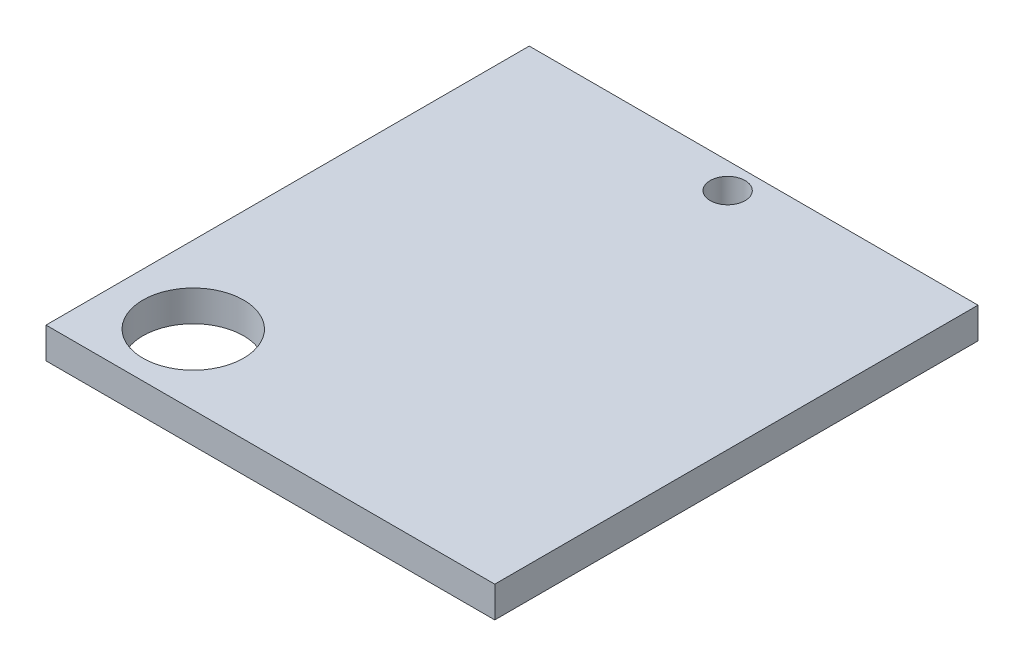
ISO-10303-21;
HEADER;
FILE_DESCRIPTION(('STEP AP214'),'2;1');
FILE_NAME('part.step','',(''),(''),'','','');
FILE_SCHEMA(('AUTOMOTIVE_DESIGN { 1 0 10303 214 1 1 1 1 }'));
ENDSEC;
DATA;
#1=APPLICATION_CONTEXT('core data for automotive mechanical design processes');
#2=APPLICATION_PROTOCOL_DEFINITION('international standard','automotive_design',2000,#1);
#3=PRODUCT_CONTEXT('',#1,'mechanical');
#4=PRODUCT('Part','Part','',(#3));
#5=PRODUCT_RELATED_PRODUCT_CATEGORY('part','',(#4));
#6=PRODUCT_DEFINITION_FORMATION('','',#4);
#7=PRODUCT_DEFINITION_CONTEXT('part definition',#1,'design');
#8=PRODUCT_DEFINITION('design','',#6,#7);
#9=PRODUCT_DEFINITION_SHAPE('','',#8);
#10=(LENGTH_UNIT() NAMED_UNIT(*) SI_UNIT(.MILLI.,.METRE.));
#11=(NAMED_UNIT(*) PLANE_ANGLE_UNIT() SI_UNIT($,.RADIAN.));
#12=(NAMED_UNIT(*) SI_UNIT($,.STERADIAN.) SOLID_ANGLE_UNIT());
#13=UNCERTAINTY_MEASURE_WITH_UNIT(LENGTH_MEASURE(1.E-05),#10,'distance_accuracy_value','');
#14=(GEOMETRIC_REPRESENTATION_CONTEXT(3) GLOBAL_UNCERTAINTY_ASSIGNED_CONTEXT((#13)) GLOBAL_UNIT_ASSIGNED_CONTEXT((#10,
#11,#12)) REPRESENTATION_CONTEXT('',''));
#15=CARTESIAN_POINT('',(0.,0.,0.));
#16=DIRECTION('',(0.,0.,1.));
#17=DIRECTION('',(1.,0.,0.));
#18=AXIS2_PLACEMENT_3D('',#15,#16,#17);
#19=CARTESIAN_POINT('',(28.95,4.,-21.3012784090909));
#20=DIRECTION('',(-1.,0.,0.));
#21=DIRECTION('',(0.,0.,1.));
#22=AXIS2_PLACEMENT_3D('',#19,#20,#21);
#23=PLANE('',#22);
#24=DIRECTION('',(0.,0.,-1.));
#25=VECTOR('',#24,1.);
#26=CARTESIAN_POINT('',(28.95,0.,-21.3012784090909));
#27=LINE('',#26,#25);
#28=CARTESIAN_POINT('',(28.95,0.,41.0487215909091));
#29=VERTEX_POINT('',#28);
#30=CARTESIAN_POINT('',(28.95,0.,-21.3012784090909));
#31=VERTEX_POINT('',#30);
#32=EDGE_CURVE('E113',#29,#31,#27,.T.);
#33=ORIENTED_EDGE('',*,*,#32,.T.);
#34=DIRECTION('',(0.,-1.,0.));
#35=VECTOR('',#34,1.);
#36=CARTESIAN_POINT('',(28.95,4.,-21.3012784090909));
#37=LINE('',#36,#35);
#38=CARTESIAN_POINT('',(28.95,4.,-21.3012784090909));
#39=VERTEX_POINT('',#38);
#40=EDGE_CURVE('E11',#39,#31,#37,.T.);
#41=ORIENTED_EDGE('',*,*,#40,.F.);
#42=DIRECTION('',(0.,0.,-1.));
#43=VECTOR('',#42,1.);
#44=CARTESIAN_POINT('',(28.95,4.,-21.3012784090909));
#45=LINE('',#44,#43);
#46=CARTESIAN_POINT('',(28.95,4.,41.0487215909091));
#47=VERTEX_POINT('',#46);
#48=EDGE_CURVE('E96',#47,#39,#45,.T.);
#49=ORIENTED_EDGE('',*,*,#48,.F.);
#50=DIRECTION('',(0.,-1.,0.));
#51=VECTOR('',#50,1.);
#52=CARTESIAN_POINT('',(28.95,4.,41.0487215909091));
#53=LINE('',#52,#51);
#54=EDGE_CURVE('E109',#47,#29,#53,.T.);
#55=ORIENTED_EDGE('',*,*,#54,.T.);
#56=EDGE_LOOP('',(#33,#41,#49,#55));
#57=FACE_BOUND('',#56,.T.);
#58=ADVANCED_FACE('F43',(#57),#23,.F.);
#59=CARTESIAN_POINT('',(-28.95,4.,-21.3012784090909));
#60=DIRECTION('',(0.,0.,1.));
#61=DIRECTION('',(1.,0.,0.));
#62=AXIS2_PLACEMENT_3D('',#59,#60,#61);
#63=PLANE('',#62);
#64=DIRECTION('',(-1.,0.,0.));
#65=VECTOR('',#64,1.);
#66=CARTESIAN_POINT('',(-28.95,0.,-21.3012784090909));
#67=LINE('',#66,#65);
#68=CARTESIAN_POINT('',(-28.95,0.,-21.3012784090909));
#69=VERTEX_POINT('',#68);
#70=EDGE_CURVE('E101',#31,#69,#67,.T.);
#71=ORIENTED_EDGE('',*,*,#70,.T.);
#72=DIRECTION('',(0.,-1.,0.));
#73=VECTOR('',#72,1.);
#74=CARTESIAN_POINT('',(-28.95,4.,-21.3012784090909));
#75=LINE('',#74,#73);
#76=CARTESIAN_POINT('',(-28.95,4.,-21.3012784090909));
#77=VERTEX_POINT('',#76);
#78=EDGE_CURVE('E53',#77,#69,#75,.T.);
#79=ORIENTED_EDGE('',*,*,#78,.F.);
#80=DIRECTION('',(-1.,0.,0.));
#81=VECTOR('',#80,1.);
#82=CARTESIAN_POINT('',(-28.95,4.,-21.3012784090909));
#83=LINE('',#82,#81);
#84=EDGE_CURVE('E91',#39,#77,#83,.T.);
#85=ORIENTED_EDGE('',*,*,#84,.F.);
#86=ORIENTED_EDGE('',*,*,#40,.T.);
#87=EDGE_LOOP('',(#71,#79,#85,#86));
#88=FACE_BOUND('',#87,.T.);
#89=ADVANCED_FACE('F100',(#88),#63,.F.);
#90=CARTESIAN_POINT('',(-28.95,4.,-21.3012784090909));
#91=DIRECTION('',(1.,0.,0.));
#92=DIRECTION('',(0.,0.,-1.));
#93=AXIS2_PLACEMENT_3D('',#90,#91,#92);
#94=PLANE('',#93);
#95=DIRECTION('',(0.,0.,1.));
#96=VECTOR('',#95,1.);
#97=CARTESIAN_POINT('',(-28.95,0.,-21.3012784090909));
#98=LINE('',#97,#96);
#99=CARTESIAN_POINT('',(-28.95,0.,41.0487215909091));
#100=VERTEX_POINT('',#99);
#101=EDGE_CURVE('E78',#69,#100,#98,.T.);
#102=ORIENTED_EDGE('',*,*,#101,.T.);
#103=DIRECTION('',(0.,-1.,0.));
#104=VECTOR('',#103,1.);
#105=CARTESIAN_POINT('',(-28.95,4.,41.0487215909091));
#106=LINE('',#105,#104);
#107=CARTESIAN_POINT('',(-28.95,4.,41.0487215909091));
#108=VERTEX_POINT('',#107);
#109=EDGE_CURVE('E103',#108,#100,#106,.T.);
#110=ORIENTED_EDGE('',*,*,#109,.F.);
#111=DIRECTION('',(0.,0.,1.));
#112=VECTOR('',#111,1.);
#113=CARTESIAN_POINT('',(-28.95,4.,-21.3012784090909));
#114=LINE('',#113,#112);
#115=EDGE_CURVE('E94',#77,#108,#114,.T.);
#116=ORIENTED_EDGE('',*,*,#115,.F.);
#117=ORIENTED_EDGE('',*,*,#78,.T.);
#118=EDGE_LOOP('',(#102,#110,#116,#117));
#119=FACE_BOUND('',#118,.T.);
#120=ADVANCED_FACE('F105',(#119),#94,.F.);
#121=CARTESIAN_POINT('',(-28.95,4.,41.0487215909091));
#122=DIRECTION('',(0.,0.,-1.));
#123=DIRECTION('',(-1.,0.,0.));
#124=AXIS2_PLACEMENT_3D('',#121,#122,#123);
#125=PLANE('',#124);
#126=DIRECTION('',(1.,0.,0.));
#127=VECTOR('',#126,1.);
#128=CARTESIAN_POINT('',(-28.95,0.,41.0487215909091));
#129=LINE('',#128,#127);
#130=EDGE_CURVE('E84',#100,#29,#129,.T.);
#131=ORIENTED_EDGE('',*,*,#130,.T.);
#132=ORIENTED_EDGE('',*,*,#54,.F.);
#133=DIRECTION('',(1.,0.,0.));
#134=VECTOR('',#133,1.);
#135=CARTESIAN_POINT('',(-28.95,4.,41.0487215909091));
#136=LINE('',#135,#134);
#137=EDGE_CURVE('E61',#108,#47,#136,.T.);
#138=ORIENTED_EDGE('',*,*,#137,.F.);
#139=ORIENTED_EDGE('',*,*,#109,.T.);
#140=EDGE_LOOP('',(#131,#132,#138,#139));
#141=FACE_BOUND('',#140,.T.);
#142=ADVANCED_FACE('F127',(#141),#125,.F.);
#143=CARTESIAN_POINT('',(0.,4.,0.));
#144=DIRECTION('',(0.,1.,0.));
#145=DIRECTION('',(0.,0.,1.));
#146=AXIS2_PLACEMENT_3D('',#143,#144,#145);
#147=PLANE('',#146);
#148=CARTESIAN_POINT('',(0.,4.,-17.9512784090909));
#149=DIRECTION('',(0.,1.,0.));
#150=DIRECTION('',(0.,0.,1.));
#151=AXIS2_PLACEMENT_3D('',#148,#149,#150);
#152=CIRCLE('',#151,2.25);
#153=CARTESIAN_POINT('',(0.,4.,-15.7012784090909));
#154=VERTEX_POINT('',#153);
#155=EDGE_CURVE('E141',#154,#154,#152,.T.);
#156=ORIENTED_EDGE('',*,*,#155,.F.);
#157=EDGE_LOOP('',(#156));
#158=FACE_BOUND('',#157,.T.);
#159=CARTESIAN_POINT('',(-19.,4.,32.));
#160=DIRECTION('',(0.,-1.,0.));
#161=DIRECTION('',(0.,0.,-1.));
#162=AXIS2_PLACEMENT_3D('',#159,#160,#161);
#163=CIRCLE('',#162,6.5);
#164=CARTESIAN_POINT('',(-19.,4.,25.5));
#165=VERTEX_POINT('',#164);
#166=EDGE_CURVE('E117',#165,#165,#163,.T.);
#167=ORIENTED_EDGE('',*,*,#166,.T.);
#168=EDGE_LOOP('',(#167));
#169=FACE_BOUND('',#168,.T.);
#170=ORIENTED_EDGE('',*,*,#48,.T.);
#171=ORIENTED_EDGE('',*,*,#84,.T.);
#172=ORIENTED_EDGE('',*,*,#115,.T.);
#173=ORIENTED_EDGE('',*,*,#137,.T.);
#174=EDGE_LOOP('',(#170,#171,#172,#173));
#175=FACE_BOUND('',#174,.T.);
#176=ADVANCED_FACE('F92',(#158,#169,#175),#147,.T.);
#177=CARTESIAN_POINT('',(0.,0.,0.));
#178=DIRECTION('',(0.,1.,0.));
#179=DIRECTION('',(0.,0.,1.));
#180=AXIS2_PLACEMENT_3D('',#177,#178,#179);
#181=PLANE('',#180);
#182=CARTESIAN_POINT('',(0.,0.,-17.9512784090909));
#183=DIRECTION('',(0.,1.,0.));
#184=DIRECTION('',(0.,0.,1.));
#185=AXIS2_PLACEMENT_3D('',#182,#183,#184);
#186=CIRCLE('',#185,2.25);
#187=CARTESIAN_POINT('',(0.,0.,-15.7012784090909));
#188=VERTEX_POINT('',#187);
#189=EDGE_CURVE('E46',#188,#188,#186,.T.);
#190=ORIENTED_EDGE('',*,*,#189,.T.);
#191=EDGE_LOOP('',(#190));
#192=FACE_BOUND('',#191,.T.);
#193=CARTESIAN_POINT('',(-19.,0.,32.));
#194=DIRECTION('',(0.,-1.,0.));
#195=DIRECTION('',(0.,0.,-1.));
#196=AXIS2_PLACEMENT_3D('',#193,#194,#195);
#197=CIRCLE('',#196,6.5);
#198=CARTESIAN_POINT('',(-19.,0.,25.5));
#199=VERTEX_POINT('',#198);
#200=EDGE_CURVE('E134',#199,#199,#197,.T.);
#201=ORIENTED_EDGE('',*,*,#200,.F.);
#202=EDGE_LOOP('',(#201));
#203=FACE_BOUND('',#202,.T.);
#204=ORIENTED_EDGE('',*,*,#32,.F.);
#205=ORIENTED_EDGE('',*,*,#130,.F.);
#206=ORIENTED_EDGE('',*,*,#101,.F.);
#207=ORIENTED_EDGE('',*,*,#70,.F.);
#208=EDGE_LOOP('',(#204,#205,#206,#207));
#209=FACE_BOUND('',#208,.T.);
#210=ADVANCED_FACE('F130',(#192,#203,#209),#181,.F.);
#211=CARTESIAN_POINT('',(-19.,4.,32.));
#212=DIRECTION('',(0.,-1.,0.));
#213=DIRECTION('',(0.,0.,-1.));
#214=AXIS2_PLACEMENT_3D('',#211,#212,#213);
#215=CYLINDRICAL_SURFACE('',#214,6.5);
#216=ORIENTED_EDGE('',*,*,#166,.F.);
#217=EDGE_LOOP('',(#216));
#218=FACE_BOUND('',#217,.T.);
#219=ORIENTED_EDGE('',*,*,#200,.T.);
#220=EDGE_LOOP('',(#219));
#221=FACE_BOUND('',#220,.T.);
#222=ADVANCED_FACE('F154',(#218,#221),#215,.F.);
#223=CARTESIAN_POINT('',(0.,-6.,-17.9512784090909));
#224=DIRECTION('',(0.,1.,0.));
#225=DIRECTION('',(0.,0.,1.));
#226=AXIS2_PLACEMENT_3D('',#223,#224,#225);
#227=CYLINDRICAL_SURFACE('',#226,2.25);
#228=ORIENTED_EDGE('',*,*,#155,.T.);
#229=EDGE_LOOP('',(#228));
#230=FACE_BOUND('',#229,.T.);
#231=ORIENTED_EDGE('',*,*,#189,.F.);
#232=EDGE_LOOP('',(#231));
#233=FACE_BOUND('',#232,.T.);
#234=ADVANCED_FACE('F152',(#230,#233),#227,.F.);
#235=CLOSED_SHELL('',(#58,#89,#120,#142,#176,#210,#222,#234));
#236=MANIFOLD_SOLID_BREP('B2',#235);
#237=ADVANCED_BREP_SHAPE_REPRESENTATION('',(#18,#236),#14);
#238=SHAPE_DEFINITION_REPRESENTATION(#9,#237);
ENDSEC;
END-ISO-10303-21;
